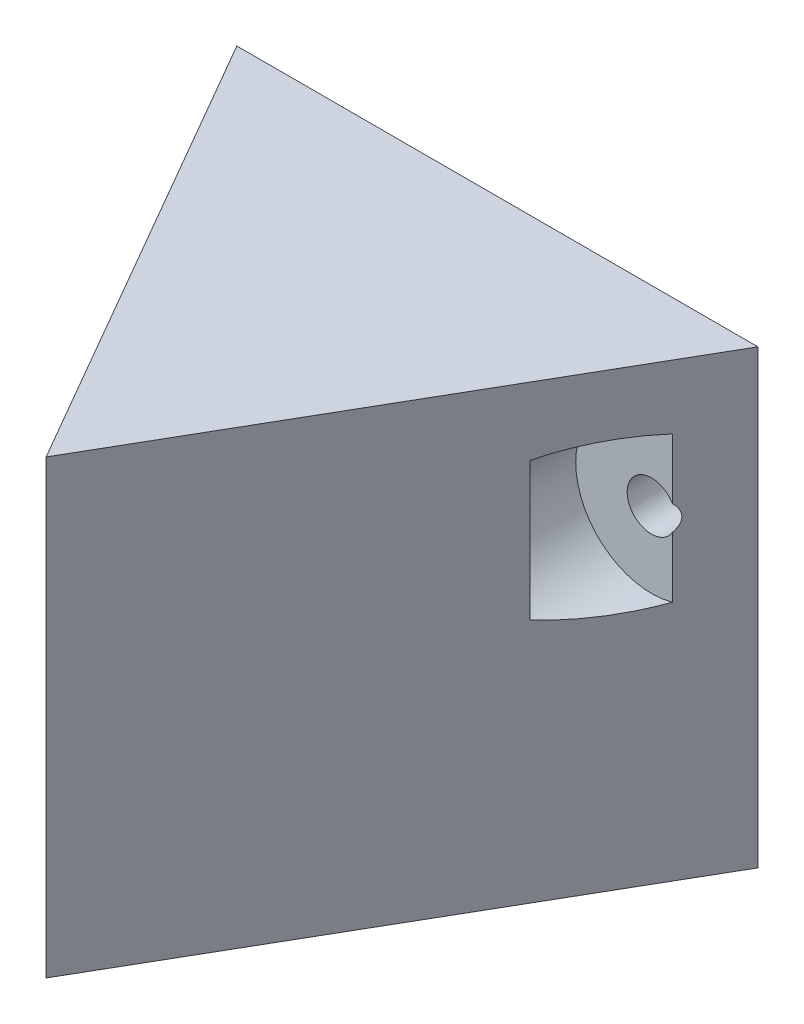
ISO-10303-21;
HEADER;
FILE_DESCRIPTION(('STEP AP214'),'2;1');
FILE_NAME('part.step','',(''),(''),'','','');
FILE_SCHEMA(('AUTOMOTIVE_DESIGN { 1 0 10303 214 1 1 1 1 }'));
ENDSEC;
DATA;
#1=APPLICATION_CONTEXT('core data for automotive mechanical design processes');
#2=APPLICATION_PROTOCOL_DEFINITION('international standard','automotive_design',2000,#1);
#3=PRODUCT_CONTEXT('',#1,'mechanical');
#4=PRODUCT('Part','Part','',(#3));
#5=PRODUCT_RELATED_PRODUCT_CATEGORY('part','',(#4));
#6=PRODUCT_DEFINITION_FORMATION('','',#4);
#7=PRODUCT_DEFINITION_CONTEXT('part definition',#1,'design');
#8=PRODUCT_DEFINITION('design','',#6,#7);
#9=PRODUCT_DEFINITION_SHAPE('','',#8);
#10=(LENGTH_UNIT() NAMED_UNIT(*) SI_UNIT(.MILLI.,.METRE.));
#11=(NAMED_UNIT(*) PLANE_ANGLE_UNIT() SI_UNIT($,.RADIAN.));
#12=(NAMED_UNIT(*) SI_UNIT($,.STERADIAN.) SOLID_ANGLE_UNIT());
#13=UNCERTAINTY_MEASURE_WITH_UNIT(LENGTH_MEASURE(1.E-05),#10,'distance_accuracy_value','');
#14=(GEOMETRIC_REPRESENTATION_CONTEXT(3) GLOBAL_UNCERTAINTY_ASSIGNED_CONTEXT((#13)) GLOBAL_UNIT_ASSIGNED_CONTEXT((#10,
#11,#12)) REPRESENTATION_CONTEXT('',''));
#15=CARTESIAN_POINT('',(0.,0.,0.));
#16=DIRECTION('',(0.,0.,1.));
#17=DIRECTION('',(1.,0.,0.));
#18=AXIS2_PLACEMENT_3D('',#15,#16,#17);
#19=CARTESIAN_POINT('',(28.8675134594814,25.,0.));
#20=DIRECTION('',(0.866025403784435,0.,0.500000000000006));
#21=DIRECTION('',(0.500000000000006,0.,-0.866025403784435));
#22=AXIS2_PLACEMENT_3D('',#19,#20,#21);
#23=PLANE('',#22);
#24=DIRECTION('',(0.,1.,0.));
#25=VECTOR('',#24,1.);
#26=CARTESIAN_POINT('',(25.4034118443436,25.,5.99999999999999));
#27=LINE('',#26,#25);
#28=CARTESIAN_POINT('',(25.4034118443436,1.76238123663125,5.99999999999999));
#29=VERTEX_POINT('',#28);
#30=CARTESIAN_POINT('',(25.4034118443436,8.45509620433386,5.99999999999999));
#31=VERTEX_POINT('',#30);
#32=EDGE_CURVE('E63',#29,#31,#27,.T.);
#33=ORIENTED_EDGE('',*,*,#32,.F.);
#34=CARTESIAN_POINT('',(23.0829743706158,9.83552002712159,10.0191156002832));
#35=DIRECTION('',(0.866025403784435,0.,0.500000000000006));
#36=DIRECTION('',(0.500000000000006,0.,-0.866025403784435));
#37=AXIS2_PLACEMENT_3D('',#34,#35,#36);
#38=ELLIPSE('',#37,16.7999999999998,8.4);
#39=CARTESIAN_POINT('',(19.6299091524473,2.17808308000447,16.));
#40=VERTEX_POINT('',#39);
#41=EDGE_CURVE('E11',#40,#29,#38,.T.);
#42=ORIENTED_EDGE('',*,*,#41,.F.);
#43=DIRECTION('',(0.,1.,0.));
#44=VECTOR('',#43,1.);
#45=CARTESIAN_POINT('',(19.6299091524473,25.,16.));
#46=LINE('',#45,#44);
#47=CARTESIAN_POINT('',(19.6299091524473,17.4929569742387,16.));
#48=VERTEX_POINT('',#47);
#49=EDGE_CURVE('E42',#40,#48,#46,.T.);
#50=ORIENTED_EDGE('',*,*,#49,.T.);
#51=CARTESIAN_POINT('',(25.4034118443436,17.9086588176119,5.99999999999999));
#52=VERTEX_POINT('',#51);
#53=EDGE_CURVE('E48',#52,#48,#38,.T.);
#54=ORIENTED_EDGE('',*,*,#53,.F.);
#55=CARTESIAN_POINT('',(25.4034118443436,11.2159438499093,5.99999999999999));
#56=VERTEX_POINT('',#55);
#57=EDGE_CURVE('E110',#56,#52,#27,.T.);
#58=ORIENTED_EDGE('',*,*,#57,.F.);
#59=CARTESIAN_POINT('',(23.0829743706158,9.83552002712159,10.0191156002832));
#60=DIRECTION('',(0.866025403784435,0.,0.500000000000006));
#61=DIRECTION('',(-0.500000000000006,0.,0.866025403784435));
#62=AXIS2_PLACEMENT_3D('',#59,#60,#61);
#63=ELLIPSE('',#62,5.39999999999994,2.7);
#64=EDGE_CURVE('E155',#31,#56,#63,.T.);
#65=ORIENTED_EDGE('',*,*,#64,.F.);
#66=EDGE_LOOP('',(#33,#42,#50,#54,#58,#65));
#67=FACE_BOUND('',#66,.T.);
#68=DIRECTION('',(-0.500000000000006,0.,0.866025403784435));
#69=VECTOR('',#68,1.);
#70=CARTESIAN_POINT('',(28.8675134594814,-25.,0.));
#71=LINE('',#70,#69);
#72=CARTESIAN_POINT('',(28.8675134594814,-25.,0.));
#73=VERTEX_POINT('',#72);
#74=CARTESIAN_POINT('',(-3.13053930293429E-13,-25.,50.));
#75=VERTEX_POINT('',#74);
#76=EDGE_CURVE('E180',#73,#75,#71,.T.);
#77=ORIENTED_EDGE('',*,*,#76,.F.);
#78=DIRECTION('',(0.,-1.,0.));
#79=VECTOR('',#78,1.);
#80=CARTESIAN_POINT('',(28.8675134594814,25.,0.));
#81=LINE('',#80,#79);
#82=CARTESIAN_POINT('',(28.8675134594814,25.,0.));
#83=VERTEX_POINT('',#82);
#84=EDGE_CURVE('E150',#83,#73,#81,.T.);
#85=ORIENTED_EDGE('',*,*,#84,.F.);
#86=DIRECTION('',(-0.500000000000006,0.,0.866025403784435));
#87=VECTOR('',#86,1.);
#88=CARTESIAN_POINT('',(28.8675134594814,25.,0.));
#89=LINE('',#88,#87);
#90=CARTESIAN_POINT('',(-3.13053930293429E-13,25.,50.));
#91=VERTEX_POINT('',#90);
#92=EDGE_CURVE('E175',#83,#91,#89,.T.);
#93=ORIENTED_EDGE('',*,*,#92,.T.);
#94=DIRECTION('',(0.,-1.,0.));
#95=VECTOR('',#94,1.);
#96=CARTESIAN_POINT('',(-3.13053930293429E-13,25.,50.));
#97=LINE('',#96,#95);
#98=EDGE_CURVE('E162',#91,#75,#97,.T.);
#99=ORIENTED_EDGE('',*,*,#98,.T.);
#100=EDGE_LOOP('',(#77,#85,#93,#99));
#101=FACE_BOUND('',#100,.T.);
#102=ADVANCED_FACE('F39',(#67,#101),#23,.T.);
#103=CARTESIAN_POINT('',(-28.8675134594814,25.,0.));
#104=DIRECTION('',(0.,0.,-1.));
#105=DIRECTION('',(-1.,0.,0.));
#106=AXIS2_PLACEMENT_3D('',#103,#104,#105);
#107=PLANE('',#106);
#108=CARTESIAN_POINT('',(-23.0706673686455,0.,0.));
#109=DIRECTION('',(0.,0.,-1.));
#110=DIRECTION('',(-1.,0.,0.));
#111=AXIS2_PLACEMENT_3D('',#108,#109,#110);
#112=CIRCLE('',#111,2.7);
#113=CARTESIAN_POINT('',(-25.7706673686455,0.,0.));
#114=VERTEX_POINT('',#113);
#115=EDGE_CURVE('E156',#114,#114,#112,.T.);
#116=ORIENTED_EDGE('',*,*,#115,.F.);
#117=EDGE_LOOP('',(#116));
#118=FACE_BOUND('',#117,.T.);
#119=CARTESIAN_POINT('',(23.0829743706158,9.83552002712159,0.));
#120=DIRECTION('',(0.,0.,-1.));
#121=DIRECTION('',(-1.,0.,0.));
#122=AXIS2_PLACEMENT_3D('',#119,#120,#121);
#123=CIRCLE('',#122,2.7);
#124=CARTESIAN_POINT('',(20.3829743706158,9.83552002712159,0.));
#125=VERTEX_POINT('',#124);
#126=EDGE_CURVE('E151',#125,#125,#123,.T.);
#127=ORIENTED_EDGE('',*,*,#126,.F.);
#128=EDGE_LOOP('',(#127));
#129=FACE_BOUND('',#128,.T.);
#130=DIRECTION('',(1.,0.,0.));
#131=VECTOR('',#130,1.);
#132=CARTESIAN_POINT('',(-28.8675134594814,-25.,0.));
#133=LINE('',#132,#131);
#134=CARTESIAN_POINT('',(-28.8675134594814,-25.,0.));
#135=VERTEX_POINT('',#134);
#136=EDGE_CURVE('E171',#135,#73,#133,.T.);
#137=ORIENTED_EDGE('',*,*,#136,.F.);
#138=DIRECTION('',(0.,-1.,0.));
#139=VECTOR('',#138,1.);
#140=CARTESIAN_POINT('',(-28.8675134594814,25.,0.));
#141=LINE('',#140,#139);
#142=CARTESIAN_POINT('',(-28.8675134594814,25.,0.));
#143=VERTEX_POINT('',#142);
#144=EDGE_CURVE('E165',#143,#135,#141,.T.);
#145=ORIENTED_EDGE('',*,*,#144,.F.);
#146=DIRECTION('',(1.,0.,0.));
#147=VECTOR('',#146,1.);
#148=CARTESIAN_POINT('',(-28.8675134594814,25.,0.));
#149=LINE('',#148,#147);
#150=EDGE_CURVE('E166',#143,#83,#149,.T.);
#151=ORIENTED_EDGE('',*,*,#150,.T.);
#152=ORIENTED_EDGE('',*,*,#84,.T.);
#153=EDGE_LOOP('',(#137,#145,#151,#152));
#154=FACE_BOUND('',#153,.T.);
#155=ADVANCED_FACE('F232',(#118,#129,#154),#107,.T.);
#156=CARTESIAN_POINT('',(-28.8675134594814,25.,0.));
#157=DIRECTION('',(0.86602540378444,0.,-0.499999999999998));
#158=DIRECTION('',(-0.499999999999998,0.,-0.86602540378444));
#159=AXIS2_PLACEMENT_3D('',#156,#157,#158);
#160=PLANE('',#159);
#161=CARTESIAN_POINT('',(-23.0706673686455,0.,10.0404319529849));
#162=DIRECTION('',(0.86602540378444,0.,-0.499999999999998));
#163=DIRECTION('',(-0.499999999999998,0.,-0.86602540378444));
#164=AXIS2_PLACEMENT_3D('',#161,#162,#163);
#165=ELLIPSE('',#164,16.8000000000001,8.4);
#166=CARTESIAN_POINT('',(-19.6299091524475,-7.6629748073229,16.));
#167=VERTEX_POINT('',#166);
#168=CARTESIAN_POINT('',(-25.4034118443437,-8.06959126666894,5.99999999999999));
#169=VERTEX_POINT('',#168);
#170=EDGE_CURVE('E133',#167,#169,#165,.T.);
#171=ORIENTED_EDGE('',*,*,#170,.T.);
#172=DIRECTION('',(0.,1.,0.));
#173=VECTOR('',#172,1.);
#174=CARTESIAN_POINT('',(-25.4034118443437,25.,5.99999999999999));
#175=LINE('',#174,#173);
#176=CARTESIAN_POINT('',(-25.4034118443437,-1.35952315577916,5.99999999999999));
#177=VERTEX_POINT('',#176);
#178=EDGE_CURVE('E161',#169,#177,#175,.T.);
#179=ORIENTED_EDGE('',*,*,#178,.T.);
#180=CARTESIAN_POINT('',(-23.0706673686455,0.,10.0404319529849));
#181=DIRECTION('',(0.86602540378444,0.,-0.499999999999998));
#182=DIRECTION('',(0.499999999999998,0.,0.86602540378444));
#183=AXIS2_PLACEMENT_3D('',#180,#181,#182);
#184=ELLIPSE('',#183,5.40000000000003,2.7);
#185=CARTESIAN_POINT('',(-25.4034118443437,1.35952315577916,5.99999999999999));
#186=VERTEX_POINT('',#185);
#187=EDGE_CURVE('E157',#177,#186,#184,.T.);
#188=ORIENTED_EDGE('',*,*,#187,.T.);
#189=CARTESIAN_POINT('',(-25.4034118443437,8.06959126666894,5.99999999999999));
#190=VERTEX_POINT('',#189);
#191=EDGE_CURVE('E55',#186,#190,#175,.T.);
#192=ORIENTED_EDGE('',*,*,#191,.T.);
#193=CARTESIAN_POINT('',(-19.6299091524475,7.6629748073229,16.));
#194=VERTEX_POINT('',#193);
#195=EDGE_CURVE('E139',#190,#194,#165,.T.);
#196=ORIENTED_EDGE('',*,*,#195,.T.);
#197=DIRECTION('',(0.,1.,0.));
#198=VECTOR('',#197,1.);
#199=CARTESIAN_POINT('',(-19.6299091524475,25.,16.));
#200=LINE('',#199,#198);
#201=EDGE_CURVE('E137',#167,#194,#200,.T.);
#202=ORIENTED_EDGE('',*,*,#201,.F.);
#203=EDGE_LOOP('',(#171,#179,#188,#192,#196,#202));
#204=FACE_BOUND('',#203,.T.);
#205=DIRECTION('',(0.499999999999998,0.,0.86602540378444));
#206=VECTOR('',#205,1.);
#207=CARTESIAN_POINT('',(-28.8675134594814,-25.,0.));
#208=LINE('',#207,#206);
#209=EDGE_CURVE('E176',#135,#75,#208,.T.);
#210=ORIENTED_EDGE('',*,*,#209,.T.);
#211=ORIENTED_EDGE('',*,*,#98,.F.);
#212=DIRECTION('',(0.499999999999998,0.,0.86602540378444));
#213=VECTOR('',#212,1.);
#214=CARTESIAN_POINT('',(-28.8675134594814,25.,0.));
#215=LINE('',#214,#213);
#216=EDGE_CURVE('E187',#143,#91,#215,.T.);
#217=ORIENTED_EDGE('',*,*,#216,.F.);
#218=ORIENTED_EDGE('',*,*,#144,.T.);
#219=EDGE_LOOP('',(#210,#211,#217,#218));
#220=FACE_BOUND('',#219,.T.);
#221=ADVANCED_FACE('F215',(#204,#220),#160,.F.);
#222=CARTESIAN_POINT('',(0.,25.,0.));
#223=DIRECTION('',(0.,1.,0.));
#224=DIRECTION('',(0.,0.,1.));
#225=AXIS2_PLACEMENT_3D('',#222,#223,#224);
#226=PLANE('',#225);
#227=ORIENTED_EDGE('',*,*,#92,.F.);
#228=ORIENTED_EDGE('',*,*,#150,.F.);
#229=ORIENTED_EDGE('',*,*,#216,.T.);
#230=EDGE_LOOP('',(#227,#228,#229));
#231=FACE_BOUND('',#230,.T.);
#232=ADVANCED_FACE('F241',(#231),#226,.T.);
#233=CARTESIAN_POINT('',(0.,-25.,0.));
#234=DIRECTION('',(0.,1.,0.));
#235=DIRECTION('',(0.,0.,1.));
#236=AXIS2_PLACEMENT_3D('',#233,#234,#235);
#237=PLANE('',#236);
#238=ORIENTED_EDGE('',*,*,#76,.T.);
#239=ORIENTED_EDGE('',*,*,#209,.F.);
#240=ORIENTED_EDGE('',*,*,#136,.T.);
#241=EDGE_LOOP('',(#238,#239,#240));
#242=FACE_BOUND('',#241,.T.);
#243=ADVANCED_FACE('F245',(#242),#237,.F.);
#244=CARTESIAN_POINT('',(-23.0706673686455,0.,-15.));
#245=DIRECTION('',(0.,0.,1.));
#246=DIRECTION('',(1.,0.,0.));
#247=AXIS2_PLACEMENT_3D('',#244,#245,#246);
#248=CYLINDRICAL_SURFACE('',#247,2.7);
#249=ORIENTED_EDGE('',*,*,#115,.T.);
#250=EDGE_LOOP('',(#249));
#251=FACE_BOUND('',#250,.T.);
#252=ORIENTED_EDGE('',*,*,#187,.F.);
#253=CARTESIAN_POINT('',(-23.0706673686455,0.,5.99999999999999));
#254=DIRECTION('',(0.,0.,-1.));
#255=DIRECTION('',(-1.,0.,0.));
#256=AXIS2_PLACEMENT_3D('',#253,#254,#255);
#257=CIRCLE('',#256,2.7);
#258=EDGE_CURVE('E145',#177,#186,#257,.F.);
#259=ORIENTED_EDGE('',*,*,#258,.T.);
#260=EDGE_LOOP('',(#252,#259));
#261=FACE_BOUND('',#260,.T.);
#262=ADVANCED_FACE('F219',(#251,#261),#248,.F.);
#263=CARTESIAN_POINT('',(23.0829743706158,9.83552002712159,-15.));
#264=DIRECTION('',(0.,0.,1.));
#265=DIRECTION('',(1.,0.,0.));
#266=AXIS2_PLACEMENT_3D('',#263,#264,#265);
#267=CYLINDRICAL_SURFACE('',#266,2.7);
#268=ORIENTED_EDGE('',*,*,#64,.T.);
#269=CARTESIAN_POINT('',(23.0829743706158,9.83552002712159,5.99999999999999));
#270=DIRECTION('',(0.,0.,-1.));
#271=DIRECTION('',(-1.,0.,0.));
#272=AXIS2_PLACEMENT_3D('',#269,#270,#271);
#273=CIRCLE('',#272,2.7);
#274=EDGE_CURVE('E114',#56,#31,#273,.F.);
#275=ORIENTED_EDGE('',*,*,#274,.T.);
#276=EDGE_LOOP('',(#268,#275));
#277=FACE_BOUND('',#276,.T.);
#278=ORIENTED_EDGE('',*,*,#126,.T.);
#279=EDGE_LOOP('',(#278));
#280=FACE_BOUND('',#279,.T.);
#281=ADVANCED_FACE('F252',(#277,#280),#267,.F.);
#282=CARTESIAN_POINT('',(23.0829743706158,9.83552002712159,16.));
#283=DIRECTION('',(0.,0.,-1.));
#284=DIRECTION('',(-1.,0.,0.));
#285=AXIS2_PLACEMENT_3D('',#282,#283,#284);
#286=CYLINDRICAL_SURFACE('',#285,8.4);
#287=ORIENTED_EDGE('',*,*,#53,.T.);
#288=CARTESIAN_POINT('',(23.0829743706158,9.83552002712159,16.));
#289=DIRECTION('',(0.,0.,-1.));
#290=DIRECTION('',(-1.,0.,0.));
#291=AXIS2_PLACEMENT_3D('',#288,#289,#290);
#292=CIRCLE('',#291,8.4);
#293=EDGE_CURVE('E120',#40,#48,#292,.T.);
#294=ORIENTED_EDGE('',*,*,#293,.F.);
#295=ORIENTED_EDGE('',*,*,#41,.T.);
#296=CARTESIAN_POINT('',(23.0829743706158,9.83552002712159,5.99999999999999));
#297=DIRECTION('',(0.,0.,-1.));
#298=DIRECTION('',(-1.,0.,0.));
#299=AXIS2_PLACEMENT_3D('',#296,#297,#298);
#300=CIRCLE('',#299,8.4);
#301=EDGE_CURVE('E113',#29,#52,#300,.T.);
#302=ORIENTED_EDGE('',*,*,#301,.T.);
#303=EDGE_LOOP('',(#287,#294,#295,#302));
#304=FACE_BOUND('',#303,.T.);
#305=ADVANCED_FACE('F123',(#304),#286,.F.);
#306=CARTESIAN_POINT('',(23.0829743706158,9.83552002712159,16.));
#307=DIRECTION('',(0.,0.,-1.));
#308=DIRECTION('',(-1.,0.,0.));
#309=AXIS2_PLACEMENT_3D('',#306,#307,#308);
#310=PLANE('',#309);
#311=ORIENTED_EDGE('',*,*,#293,.T.);
#312=ORIENTED_EDGE('',*,*,#49,.F.);
#313=EDGE_LOOP('',(#311,#312));
#314=FACE_BOUND('',#313,.T.);
#315=ADVANCED_FACE('F209',(#314),#310,.T.);
#316=CARTESIAN_POINT('',(23.0829743706158,9.83552002712159,5.99999999999999));
#317=DIRECTION('',(0.,0.,-1.));
#318=DIRECTION('',(-1.,0.,0.));
#319=AXIS2_PLACEMENT_3D('',#316,#317,#318);
#320=PLANE('',#319);
#321=ORIENTED_EDGE('',*,*,#32,.T.);
#322=ORIENTED_EDGE('',*,*,#274,.F.);
#323=ORIENTED_EDGE('',*,*,#57,.T.);
#324=ORIENTED_EDGE('',*,*,#301,.F.);
#325=EDGE_LOOP('',(#321,#322,#323,#324));
#326=FACE_BOUND('',#325,.T.);
#327=ADVANCED_FACE('F112',(#326),#320,.F.);
#328=CARTESIAN_POINT('',(-23.0706673686455,0.,16.));
#329=DIRECTION('',(0.,0.,-1.));
#330=DIRECTION('',(-1.,0.,0.));
#331=AXIS2_PLACEMENT_3D('',#328,#329,#330);
#332=CYLINDRICAL_SURFACE('',#331,8.4);
#333=CARTESIAN_POINT('',(-23.0706673686455,0.,5.99999999999999));
#334=DIRECTION('',(0.,0.,-1.));
#335=DIRECTION('',(-1.,0.,0.));
#336=AXIS2_PLACEMENT_3D('',#333,#334,#335);
#337=CIRCLE('',#336,8.4);
#338=EDGE_CURVE('E200',#190,#169,#337,.T.);
#339=ORIENTED_EDGE('',*,*,#338,.T.);
#340=ORIENTED_EDGE('',*,*,#170,.F.);
#341=CARTESIAN_POINT('',(-23.0706673686455,0.,16.));
#342=DIRECTION('',(0.,0.,-1.));
#343=DIRECTION('',(-1.,0.,0.));
#344=AXIS2_PLACEMENT_3D('',#341,#342,#343);
#345=CIRCLE('',#344,8.4);
#346=EDGE_CURVE('E128',#194,#167,#345,.T.);
#347=ORIENTED_EDGE('',*,*,#346,.F.);
#348=ORIENTED_EDGE('',*,*,#195,.F.);
#349=EDGE_LOOP('',(#339,#340,#347,#348));
#350=FACE_BOUND('',#349,.T.);
#351=ADVANCED_FACE('F227',(#350),#332,.F.);
#352=CARTESIAN_POINT('',(-23.0706673686455,0.,16.));
#353=DIRECTION('',(0.,0.,-1.));
#354=DIRECTION('',(-1.,0.,0.));
#355=AXIS2_PLACEMENT_3D('',#352,#353,#354);
#356=PLANE('',#355);
#357=ORIENTED_EDGE('',*,*,#201,.T.);
#358=ORIENTED_EDGE('',*,*,#346,.T.);
#359=EDGE_LOOP('',(#357,#358));
#360=FACE_BOUND('',#359,.T.);
#361=ADVANCED_FACE('F222',(#360),#356,.T.);
#362=CARTESIAN_POINT('',(-23.0706673686455,0.,5.99999999999999));
#363=DIRECTION('',(0.,0.,-1.));
#364=DIRECTION('',(-1.,0.,0.));
#365=AXIS2_PLACEMENT_3D('',#362,#363,#364);
#366=PLANE('',#365);
#367=ORIENTED_EDGE('',*,*,#338,.F.);
#368=ORIENTED_EDGE('',*,*,#191,.F.);
#369=ORIENTED_EDGE('',*,*,#258,.F.);
#370=ORIENTED_EDGE('',*,*,#178,.F.);
#371=EDGE_LOOP('',(#367,#368,#369,#370));
#372=FACE_BOUND('',#371,.T.);
#373=ADVANCED_FACE('F220',(#372),#366,.F.);
#374=CLOSED_SHELL('',(#102,#155,#221,#232,#243,#262,#281,#305,#315,#327,#351,#361,#373));
#375=MANIFOLD_SOLID_BREP('B2',#374);
#376=ADVANCED_BREP_SHAPE_REPRESENTATION('',(#18,#375),#14);
#377=SHAPE_DEFINITION_REPRESENTATION(#9,#376);
ENDSEC;
END-ISO-10303-21;
